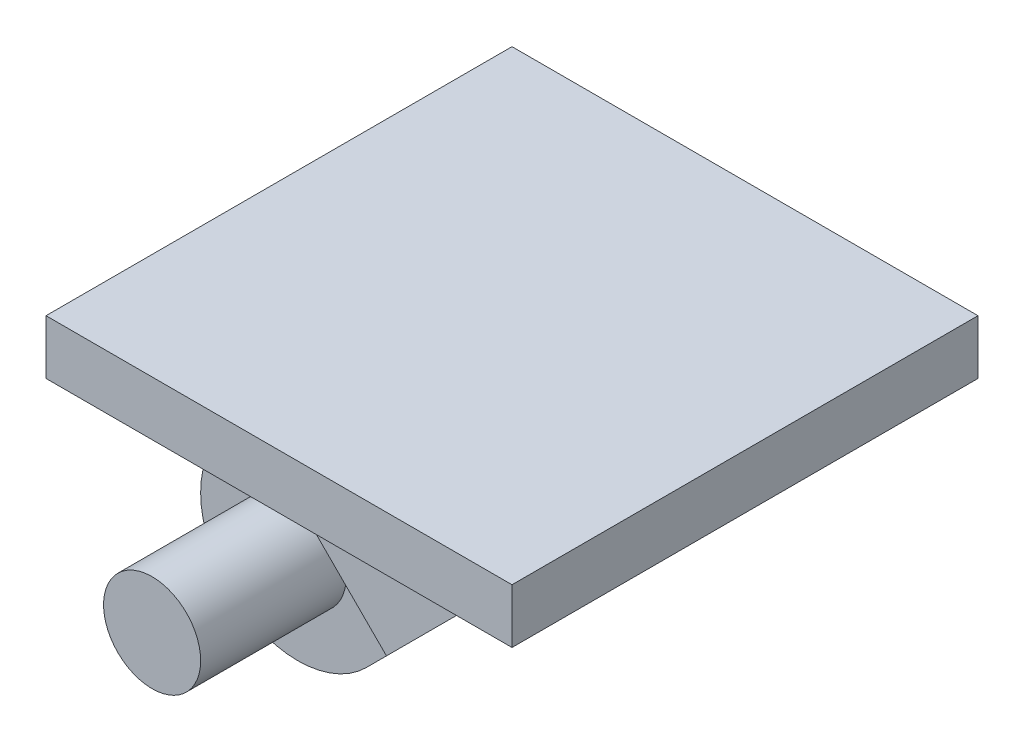
ISO-10303-21;
HEADER;
FILE_DESCRIPTION(('STEP AP214'),'2;1');
FILE_NAME('part.step','',(''),(''),'','','');
FILE_SCHEMA(('AUTOMOTIVE_DESIGN { 1 0 10303 214 1 1 1 1 }'));
ENDSEC;
DATA;
#1=APPLICATION_CONTEXT('core data for automotive mechanical design processes');
#2=APPLICATION_PROTOCOL_DEFINITION('international standard','automotive_design',2000,#1);
#3=PRODUCT_CONTEXT('',#1,'mechanical');
#4=PRODUCT('Part','Part','',(#3));
#5=PRODUCT_RELATED_PRODUCT_CATEGORY('part','',(#4));
#6=PRODUCT_DEFINITION_FORMATION('','',#4);
#7=PRODUCT_DEFINITION_CONTEXT('part definition',#1,'design');
#8=PRODUCT_DEFINITION('design','',#6,#7);
#9=PRODUCT_DEFINITION_SHAPE('','',#8);
#10=(LENGTH_UNIT() NAMED_UNIT(*) SI_UNIT(.MILLI.,.METRE.));
#11=(NAMED_UNIT(*) PLANE_ANGLE_UNIT() SI_UNIT($,.RADIAN.));
#12=(NAMED_UNIT(*) SI_UNIT($,.STERADIAN.) SOLID_ANGLE_UNIT());
#13=UNCERTAINTY_MEASURE_WITH_UNIT(LENGTH_MEASURE(1.E-05),#10,'distance_accuracy_value','');
#14=(GEOMETRIC_REPRESENTATION_CONTEXT(3) GLOBAL_UNCERTAINTY_ASSIGNED_CONTEXT((#13)) GLOBAL_UNIT_ASSIGNED_CONTEXT((#10,
#11,#12)) REPRESENTATION_CONTEXT('',''));
#15=CARTESIAN_POINT('',(0.,0.,0.));
#16=DIRECTION('',(0.,0.,1.));
#17=DIRECTION('',(1.,0.,0.));
#18=AXIS2_PLACEMENT_3D('',#15,#16,#17);
#19=CARTESIAN_POINT('',(-12.5,0.,-12.5));
#20=DIRECTION('',(-0.707106781186546,0.707106781186549,0.));
#21=DIRECTION('',(-0.707106781186549,-0.707106781186546,0.));
#22=AXIS2_PLACEMENT_3D('',#19,#20,#21);
#23=PLANE('',#22);
#24=DIRECTION('',(0.70710678118655,0.707106781186545,0.));
#25=VECTOR('',#24,1.);
#26=CARTESIAN_POINT('',(-30.1776695296637,-17.6776695296636,6.25));
#27=LINE('',#26,#25);
#28=CARTESIAN_POINT('',(-30.1776695296637,-17.6776695296637,6.25));
#29=VERTEX_POINT('',#28);
#30=CARTESIAN_POINT('',(-21.3388347648319,-8.8388347648319,6.25));
#31=VERTEX_POINT('',#30);
#32=EDGE_CURVE('E143',#29,#31,#27,.T.);
#33=ORIENTED_EDGE('',*,*,#32,.T.);
#34=DIRECTION('',(0.,0.,1.));
#35=VECTOR('',#34,1.);
#36=CARTESIAN_POINT('',(-21.3388347648319,-8.8388347648319,6.25));
#37=LINE('',#36,#35);
#38=CARTESIAN_POINT('',(-21.3388347648319,-8.8388347648319,12.5));
#39=VERTEX_POINT('',#38);
#40=EDGE_CURVE('E299',#31,#39,#37,.T.);
#41=ORIENTED_EDGE('',*,*,#40,.T.);
#42=DIRECTION('',(-0.707106781186549,-0.707106781186546,0.));
#43=VECTOR('',#42,1.);
#44=CARTESIAN_POINT('',(-12.5,0.,12.5));
#45=LINE('',#44,#43);
#46=CARTESIAN_POINT('',(-12.5,0.,12.5));
#47=VERTEX_POINT('',#46);
#48=EDGE_CURVE('E323',#47,#39,#45,.T.);
#49=ORIENTED_EDGE('',*,*,#48,.F.);
#50=DIRECTION('',(0.,0.,1.));
#51=VECTOR('',#50,1.);
#52=CARTESIAN_POINT('',(-12.5,0.,-12.5));
#53=LINE('',#52,#51);
#54=CARTESIAN_POINT('',(-12.5,0.,-12.5));
#55=VERTEX_POINT('',#54);
#56=EDGE_CURVE('E333',#55,#47,#53,.T.);
#57=ORIENTED_EDGE('',*,*,#56,.F.);
#58=DIRECTION('',(-0.707106781186549,-0.707106781186546,0.));
#59=VECTOR('',#58,1.);
#60=CARTESIAN_POINT('',(-12.5,0.,-12.5));
#61=LINE('',#60,#59);
#62=CARTESIAN_POINT('',(-21.3388347648319,-8.83883476483189,-12.5));
#63=VERTEX_POINT('',#62);
#64=EDGE_CURVE('E161',#55,#63,#61,.T.);
#65=ORIENTED_EDGE('',*,*,#64,.T.);
#66=DIRECTION('',(0.,0.,-1.));
#67=VECTOR('',#66,1.);
#68=CARTESIAN_POINT('',(-21.3388347648319,-8.8388347648319,-6.25));
#69=LINE('',#68,#67);
#70=CARTESIAN_POINT('',(-21.3388347648319,-8.8388347648319,-6.25));
#71=VERTEX_POINT('',#70);
#72=EDGE_CURVE('E64',#71,#63,#69,.T.);
#73=ORIENTED_EDGE('',*,*,#72,.F.);
#74=DIRECTION('',(-0.70710678118655,-0.707106781186545,0.));
#75=VECTOR('',#74,1.);
#76=CARTESIAN_POINT('',(-30.1776695296637,-17.6776695296636,-6.25));
#77=LINE('',#76,#75);
#78=CARTESIAN_POINT('',(-30.1776695296637,-17.6776695296637,-6.25));
#79=VERTEX_POINT('',#78);
#80=EDGE_CURVE('E305',#71,#79,#77,.T.);
#81=ORIENTED_EDGE('',*,*,#80,.T.);
#82=DIRECTION('',(0.,0.,1.));
#83=VECTOR('',#82,1.);
#84=CARTESIAN_POINT('',(-30.1776695296637,-17.6776695296637,-12.5));
#85=LINE('',#84,#83);
#86=EDGE_CURVE('E186',#79,#29,#85,.T.);
#87=ORIENTED_EDGE('',*,*,#86,.T.);
#88=EDGE_LOOP('',(#33,#41,#49,#57,#65,#73,#81,#87));
#89=FACE_BOUND('',#88,.T.);
#90=ADVANCED_FACE('F41',(#89),#23,.T.);
#91=CARTESIAN_POINT('',(-12.5000000000001,-35.3553390593274,-12.5));
#92=DIRECTION('',(0.707106781186547,-0.707106781186548,0.));
#93=DIRECTION('',(0.707106781186548,0.707106781186547,0.));
#94=AXIS2_PLACEMENT_3D('',#91,#92,#93);
#95=PLANE('',#94);
#96=DIRECTION('',(0.707106781186548,0.707106781186547,0.));
#97=VECTOR('',#96,1.);
#98=CARTESIAN_POINT('',(-12.5000000000001,-35.3553390593274,12.5));
#99=LINE('',#98,#97);
#100=CARTESIAN_POINT('',(-3.66116523516812,-26.5165042944955,12.5));
#101=VERTEX_POINT('',#100);
#102=CARTESIAN_POINT('',(5.17766952966365,-17.6776695296637,12.5));
#103=VERTEX_POINT('',#102);
#104=EDGE_CURVE('E316',#101,#103,#99,.T.);
#105=ORIENTED_EDGE('',*,*,#104,.F.);
#106=DIRECTION('',(0.,0.,1.));
#107=VECTOR('',#106,1.);
#108=CARTESIAN_POINT('',(-3.66116523516814,-26.5165042944955,6.25));
#109=LINE('',#108,#107);
#110=CARTESIAN_POINT('',(-3.66116523516814,-26.5165042944955,6.25));
#111=VERTEX_POINT('',#110);
#112=EDGE_CURVE('E56',#111,#101,#109,.T.);
#113=ORIENTED_EDGE('',*,*,#112,.F.);
#114=DIRECTION('',(-0.707106781186548,-0.707106781186548,0.));
#115=VECTOR('',#114,1.);
#116=CARTESIAN_POINT('',(-12.5,-35.3553390593274,6.25));
#117=LINE('',#116,#115);
#118=CARTESIAN_POINT('',(-12.5000000000001,-35.3553390593274,6.25));
#119=VERTEX_POINT('',#118);
#120=EDGE_CURVE('E141',#111,#119,#117,.T.);
#121=ORIENTED_EDGE('',*,*,#120,.T.);
#122=DIRECTION('',(0.,0.,1.));
#123=VECTOR('',#122,1.);
#124=CARTESIAN_POINT('',(-12.5000000000001,-35.3553390593274,-12.5));
#125=LINE('',#124,#123);
#126=CARTESIAN_POINT('',(-12.5000000000001,-35.3553390593274,-6.25));
#127=VERTEX_POINT('',#126);
#128=EDGE_CURVE('E154',#127,#119,#125,.T.);
#129=ORIENTED_EDGE('',*,*,#128,.F.);
#130=DIRECTION('',(0.707106781186548,0.707106781186548,0.));
#131=VECTOR('',#130,1.);
#132=CARTESIAN_POINT('',(-12.5,-35.3553390593274,-6.25));
#133=LINE('',#132,#131);
#134=CARTESIAN_POINT('',(-3.66116523516814,-26.5165042944955,-6.25));
#135=VERTEX_POINT('',#134);
#136=EDGE_CURVE('E309',#127,#135,#133,.T.);
#137=ORIENTED_EDGE('',*,*,#136,.T.);
#138=DIRECTION('',(0.,0.,-1.));
#139=VECTOR('',#138,1.);
#140=CARTESIAN_POINT('',(-3.66116523516814,-26.5165042944955,-6.25));
#141=LINE('',#140,#139);
#142=CARTESIAN_POINT('',(-3.66116523516814,-26.5165042944955,-12.5));
#143=VERTEX_POINT('',#142);
#144=EDGE_CURVE('E311',#135,#143,#141,.T.);
#145=ORIENTED_EDGE('',*,*,#144,.T.);
#146=DIRECTION('',(0.707106781186548,0.707106781186547,0.));
#147=VECTOR('',#146,1.);
#148=CARTESIAN_POINT('',(-12.5000000000001,-35.3553390593274,-12.5));
#149=LINE('',#148,#147);
#150=CARTESIAN_POINT('',(5.17766952966365,-17.6776695296637,-12.5));
#151=VERTEX_POINT('',#150);
#152=EDGE_CURVE('E325',#143,#151,#149,.T.);
#153=ORIENTED_EDGE('',*,*,#152,.T.);
#154=DIRECTION('',(0.,0.,1.));
#155=VECTOR('',#154,1.);
#156=CARTESIAN_POINT('',(5.17766952966365,-17.6776695296637,-12.5));
#157=LINE('',#156,#155);
#158=EDGE_CURVE('E160',#151,#103,#157,.T.);
#159=ORIENTED_EDGE('',*,*,#158,.T.);
#160=EDGE_LOOP('',(#105,#113,#121,#129,#137,#145,#153,#159));
#161=FACE_BOUND('',#160,.T.);
#162=ADVANCED_FACE('F152',(#161),#95,.T.);
#163=CARTESIAN_POINT('',(-21.3388347648319,-26.5165042944955,-12.5));
#164=DIRECTION('',(0.,0.,1.));
#165=DIRECTION('',(1.,0.,0.));
#166=AXIS2_PLACEMENT_3D('',#163,#164,#165);
#167=CYLINDRICAL_SURFACE('',#166,12.5);
#168=ORIENTED_EDGE('',*,*,#128,.T.);
#169=CARTESIAN_POINT('',(-21.3388347648319,-26.5165042944955,6.25));
#170=DIRECTION('',(0.,0.,1.));
#171=DIRECTION('',(1.,0.,0.));
#172=AXIS2_PLACEMENT_3D('',#169,#170,#171);
#173=CIRCLE('',#172,12.5);
#174=EDGE_CURVE('E137',#29,#119,#173,.T.);
#175=ORIENTED_EDGE('',*,*,#174,.F.);
#176=ORIENTED_EDGE('',*,*,#86,.F.);
#177=CARTESIAN_POINT('',(-21.3388347648319,-26.5165042944955,-6.25));
#178=DIRECTION('',(0.,0.,1.));
#179=DIRECTION('',(1.,0.,0.));
#180=AXIS2_PLACEMENT_3D('',#177,#178,#179);
#181=CIRCLE('',#180,12.5);
#182=EDGE_CURVE('E159',#79,#127,#181,.T.);
#183=ORIENTED_EDGE('',*,*,#182,.T.);
#184=EDGE_LOOP('',(#168,#175,#176,#183));
#185=FACE_BOUND('',#184,.T.);
#186=ADVANCED_FACE('F158',(#185),#167,.T.);
#187=CARTESIAN_POINT('',(-21.3388347648319,-26.5165042944955,12.5));
#188=DIRECTION('',(0.,0.,1.));
#189=DIRECTION('',(1.,0.,0.));
#190=AXIS2_PLACEMENT_3D('',#187,#188,#189);
#191=PLANE('',#190);
#192=ORIENTED_EDGE('',*,*,#48,.T.);
#193=DIRECTION('',(0.707106781186551,-0.707106781186544,0.));
#194=VECTOR('',#193,1.);
#195=CARTESIAN_POINT('',(-12.5000000000001,-17.6776695296636,12.5));
#196=LINE('',#195,#194);
#197=EDGE_CURVE('E155',#39,#101,#196,.T.);
#198=ORIENTED_EDGE('',*,*,#197,.T.);
#199=ORIENTED_EDGE('',*,*,#104,.T.);
#200=CARTESIAN_POINT('',(-12.5,0.,12.5));
#201=DIRECTION('',(0.,0.,1.));
#202=DIRECTION('',(1.,0.,0.));
#203=AXIS2_PLACEMENT_3D('',#200,#201,#202);
#204=CIRCLE('',#203,25.);
#205=CARTESIAN_POINT('',(12.5,0.,12.5));
#206=VERTEX_POINT('',#205);
#207=EDGE_CURVE('E318',#103,#206,#204,.T.);
#208=ORIENTED_EDGE('',*,*,#207,.T.);
#209=DIRECTION('',(-1.,0.,0.));
#210=VECTOR('',#209,1.);
#211=CARTESIAN_POINT('',(-12.5,0.,12.5));
#212=LINE('',#211,#210);
#213=EDGE_CURVE('E321',#206,#47,#212,.T.);
#214=ORIENTED_EDGE('',*,*,#213,.T.);
#215=EDGE_LOOP('',(#192,#198,#199,#208,#214));
#216=FACE_BOUND('',#215,.T.);
#217=ADVANCED_FACE('F245',(#216),#191,.T.);
#218=CARTESIAN_POINT('',(-21.3388347648319,-26.5165042944955,-12.5));
#219=DIRECTION('',(0.,0.,1.));
#220=DIRECTION('',(1.,0.,0.));
#221=AXIS2_PLACEMENT_3D('',#218,#219,#220);
#222=PLANE('',#221);
#223=DIRECTION('',(-0.707106781186551,0.707106781186544,0.));
#224=VECTOR('',#223,1.);
#225=CARTESIAN_POINT('',(-12.5000000000001,-17.6776695296636,-12.5));
#226=LINE('',#225,#224);
#227=EDGE_CURVE('E302',#143,#63,#226,.T.);
#228=ORIENTED_EDGE('',*,*,#227,.T.);
#229=ORIENTED_EDGE('',*,*,#64,.F.);
#230=DIRECTION('',(-1.,0.,0.));
#231=VECTOR('',#230,1.);
#232=CARTESIAN_POINT('',(-12.5,0.,-12.5));
#233=LINE('',#232,#231);
#234=CARTESIAN_POINT('',(12.5,0.,-12.5));
#235=VERTEX_POINT('',#234);
#236=EDGE_CURVE('E167',#235,#55,#233,.T.);
#237=ORIENTED_EDGE('',*,*,#236,.F.);
#238=CARTESIAN_POINT('',(-12.5,0.,-12.5));
#239=DIRECTION('',(0.,0.,1.));
#240=DIRECTION('',(1.,0.,0.));
#241=AXIS2_PLACEMENT_3D('',#238,#239,#240);
#242=CIRCLE('',#241,25.);
#243=EDGE_CURVE('E327',#151,#235,#242,.T.);
#244=ORIENTED_EDGE('',*,*,#243,.F.);
#245=ORIENTED_EDGE('',*,*,#152,.F.);
#246=EDGE_LOOP('',(#228,#229,#237,#244,#245));
#247=FACE_BOUND('',#246,.T.);
#248=ADVANCED_FACE('F242',(#247),#222,.F.);
#249=CARTESIAN_POINT('',(0.,0.,0.));
#250=DIRECTION('',(0.,-1.,0.));
#251=DIRECTION('',(0.,0.,-1.));
#252=AXIS2_PLACEMENT_3D('',#249,#250,#251);
#253=PLANE('',#252);
#254=DIRECTION('',(0.,0.,-1.));
#255=VECTOR('',#254,1.);
#256=CARTESIAN_POINT('',(30.,0.,30.));
#257=LINE('',#256,#255);
#258=CARTESIAN_POINT('',(30.,0.,30.));
#259=VERTEX_POINT('',#258);
#260=CARTESIAN_POINT('',(30.,0.,-30.));
#261=VERTEX_POINT('',#260);
#262=EDGE_CURVE('E182',#259,#261,#257,.T.);
#263=ORIENTED_EDGE('',*,*,#262,.F.);
#264=DIRECTION('',(1.,0.,0.));
#265=VECTOR('',#264,1.);
#266=CARTESIAN_POINT('',(-30.,0.,30.));
#267=LINE('',#266,#265);
#268=CARTESIAN_POINT('',(-30.,0.,30.));
#269=VERTEX_POINT('',#268);
#270=EDGE_CURVE('E175',#269,#259,#267,.T.);
#271=ORIENTED_EDGE('',*,*,#270,.F.);
#272=DIRECTION('',(0.,0.,1.));
#273=VECTOR('',#272,1.);
#274=CARTESIAN_POINT('',(-30.,0.,30.));
#275=LINE('',#274,#273);
#276=CARTESIAN_POINT('',(-30.,0.,-30.));
#277=VERTEX_POINT('',#276);
#278=EDGE_CURVE('E188',#277,#269,#275,.T.);
#279=ORIENTED_EDGE('',*,*,#278,.F.);
#280=DIRECTION('',(-1.,0.,0.));
#281=VECTOR('',#280,1.);
#282=CARTESIAN_POINT('',(-30.,0.,-30.));
#283=LINE('',#282,#281);
#284=EDGE_CURVE('E185',#261,#277,#283,.T.);
#285=ORIENTED_EDGE('',*,*,#284,.F.);
#286=EDGE_LOOP('',(#263,#271,#279,#285));
#287=FACE_BOUND('',#286,.T.);
#288=ORIENTED_EDGE('',*,*,#236,.T.);
#289=ORIENTED_EDGE('',*,*,#56,.T.);
#290=ORIENTED_EDGE('',*,*,#213,.F.);
#291=DIRECTION('',(0.,0.,1.));
#292=VECTOR('',#291,1.);
#293=CARTESIAN_POINT('',(12.5,0.,-12.5));
#294=LINE('',#293,#292);
#295=EDGE_CURVE('E164',#235,#206,#294,.T.);
#296=ORIENTED_EDGE('',*,*,#295,.F.);
#297=EDGE_LOOP('',(#288,#289,#290,#296));
#298=FACE_BOUND('',#297,.T.);
#299=ADVANCED_FACE('F209',(#287,#298),#253,.T.);
#300=CARTESIAN_POINT('',(30.,7.,30.));
#301=DIRECTION('',(-1.,0.,0.));
#302=DIRECTION('',(0.,0.,1.));
#303=AXIS2_PLACEMENT_3D('',#300,#301,#302);
#304=PLANE('',#303);
#305=ORIENTED_EDGE('',*,*,#262,.T.);
#306=DIRECTION('',(0.,-1.,0.));
#307=VECTOR('',#306,1.);
#308=CARTESIAN_POINT('',(30.,7.,-30.));
#309=LINE('',#308,#307);
#310=CARTESIAN_POINT('',(30.,7.,-30.));
#311=VERTEX_POINT('',#310);
#312=EDGE_CURVE('E49',#311,#261,#309,.T.);
#313=ORIENTED_EDGE('',*,*,#312,.F.);
#314=DIRECTION('',(0.,0.,-1.));
#315=VECTOR('',#314,1.);
#316=CARTESIAN_POINT('',(30.,7.,30.));
#317=LINE('',#316,#315);
#318=CARTESIAN_POINT('',(30.,7.,30.));
#319=VERTEX_POINT('',#318);
#320=EDGE_CURVE('E171',#319,#311,#317,.T.);
#321=ORIENTED_EDGE('',*,*,#320,.F.);
#322=DIRECTION('',(0.,-1.,0.));
#323=VECTOR('',#322,1.);
#324=CARTESIAN_POINT('',(30.,7.,30.));
#325=LINE('',#324,#323);
#326=EDGE_CURVE('E181',#319,#259,#325,.T.);
#327=ORIENTED_EDGE('',*,*,#326,.T.);
#328=EDGE_LOOP('',(#305,#313,#321,#327));
#329=FACE_BOUND('',#328,.T.);
#330=ADVANCED_FACE('F43',(#329),#304,.F.);
#331=CARTESIAN_POINT('',(-30.,7.,-30.));
#332=DIRECTION('',(0.,0.,1.));
#333=DIRECTION('',(1.,0.,0.));
#334=AXIS2_PLACEMENT_3D('',#331,#332,#333);
#335=PLANE('',#334);
#336=ORIENTED_EDGE('',*,*,#284,.T.);
#337=DIRECTION('',(0.,-1.,0.));
#338=VECTOR('',#337,1.);
#339=CARTESIAN_POINT('',(-30.,7.,-30.));
#340=LINE('',#339,#338);
#341=CARTESIAN_POINT('',(-30.,7.,-30.));
#342=VERTEX_POINT('',#341);
#343=EDGE_CURVE('E196',#342,#277,#340,.T.);
#344=ORIENTED_EDGE('',*,*,#343,.F.);
#345=DIRECTION('',(-1.,0.,0.));
#346=VECTOR('',#345,1.);
#347=CARTESIAN_POINT('',(-30.,7.,-30.));
#348=LINE('',#347,#346);
#349=EDGE_CURVE('E174',#311,#342,#348,.T.);
#350=ORIENTED_EDGE('',*,*,#349,.F.);
#351=ORIENTED_EDGE('',*,*,#312,.T.);
#352=EDGE_LOOP('',(#336,#344,#350,#351));
#353=FACE_BOUND('',#352,.T.);
#354=ADVANCED_FACE('F201',(#353),#335,.F.);
#355=CARTESIAN_POINT('',(-30.,7.,30.));
#356=DIRECTION('',(1.,0.,0.));
#357=DIRECTION('',(0.,0.,-1.));
#358=AXIS2_PLACEMENT_3D('',#355,#356,#357);
#359=PLANE('',#358);
#360=ORIENTED_EDGE('',*,*,#278,.T.);
#361=DIRECTION('',(0.,-1.,0.));
#362=VECTOR('',#361,1.);
#363=CARTESIAN_POINT('',(-30.,7.,30.));
#364=LINE('',#363,#362);
#365=CARTESIAN_POINT('',(-30.,7.,30.));
#366=VERTEX_POINT('',#365);
#367=EDGE_CURVE('E193',#366,#269,#364,.T.);
#368=ORIENTED_EDGE('',*,*,#367,.F.);
#369=DIRECTION('',(0.,0.,1.));
#370=VECTOR('',#369,1.);
#371=CARTESIAN_POINT('',(-30.,7.,30.));
#372=LINE('',#371,#370);
#373=EDGE_CURVE('E177',#342,#366,#372,.T.);
#374=ORIENTED_EDGE('',*,*,#373,.F.);
#375=ORIENTED_EDGE('',*,*,#343,.T.);
#376=EDGE_LOOP('',(#360,#368,#374,#375));
#377=FACE_BOUND('',#376,.T.);
#378=ADVANCED_FACE('F214',(#377),#359,.F.);
#379=CARTESIAN_POINT('',(-30.,7.,30.));
#380=DIRECTION('',(0.,0.,-1.));
#381=DIRECTION('',(-1.,0.,0.));
#382=AXIS2_PLACEMENT_3D('',#379,#380,#381);
#383=PLANE('',#382);
#384=ORIENTED_EDGE('',*,*,#270,.T.);
#385=ORIENTED_EDGE('',*,*,#326,.F.);
#386=DIRECTION('',(1.,0.,0.));
#387=VECTOR('',#386,1.);
#388=CARTESIAN_POINT('',(-30.,7.,30.));
#389=LINE('',#388,#387);
#390=EDGE_CURVE('E179',#366,#319,#389,.T.);
#391=ORIENTED_EDGE('',*,*,#390,.F.);
#392=ORIENTED_EDGE('',*,*,#367,.T.);
#393=EDGE_LOOP('',(#384,#385,#391,#392));
#394=FACE_BOUND('',#393,.T.);
#395=ADVANCED_FACE('F218',(#394),#383,.F.);
#396=CARTESIAN_POINT('',(0.,7.,0.));
#397=DIRECTION('',(0.,-1.,0.));
#398=DIRECTION('',(0.,0.,-1.));
#399=AXIS2_PLACEMENT_3D('',#396,#397,#398);
#400=PLANE('',#399);
#401=ORIENTED_EDGE('',*,*,#320,.T.);
#402=ORIENTED_EDGE('',*,*,#349,.T.);
#403=ORIENTED_EDGE('',*,*,#373,.T.);
#404=ORIENTED_EDGE('',*,*,#390,.T.);
#405=EDGE_LOOP('',(#401,#402,#403,#404));
#406=FACE_BOUND('',#405,.T.);
#407=ADVANCED_FACE('F220',(#406),#400,.F.);
#408=CARTESIAN_POINT('',(-12.5,0.,-12.5));
#409=DIRECTION('',(0.,0.,1.));
#410=DIRECTION('',(1.,0.,0.));
#411=AXIS2_PLACEMENT_3D('',#408,#409,#410);
#412=CYLINDRICAL_SURFACE('',#411,25.);
#413=ORIENTED_EDGE('',*,*,#295,.T.);
#414=ORIENTED_EDGE('',*,*,#207,.F.);
#415=ORIENTED_EDGE('',*,*,#158,.F.);
#416=ORIENTED_EDGE('',*,*,#243,.T.);
#417=EDGE_LOOP('',(#413,#414,#415,#416));
#418=FACE_BOUND('',#417,.T.);
#419=ADVANCED_FACE('F222',(#418),#412,.T.);
#420=CARTESIAN_POINT('',(-12.5000000000001,-17.6776695296636,-6.25));
#421=DIRECTION('',(-0.707106781186544,-0.707106781186551,0.));
#422=DIRECTION('',(0.707106781186551,-0.707106781186544,0.));
#423=AXIS2_PLACEMENT_3D('',#420,#421,#422);
#424=PLANE('',#423);
#425=ORIENTED_EDGE('',*,*,#227,.F.);
#426=ORIENTED_EDGE('',*,*,#144,.F.);
#427=DIRECTION('',(-0.707106781186551,0.707106781186544,0.));
#428=VECTOR('',#427,1.);
#429=CARTESIAN_POINT('',(-12.5000000000001,-17.6776695296636,-6.25));
#430=LINE('',#429,#428);
#431=EDGE_CURVE('E303',#135,#71,#430,.T.);
#432=ORIENTED_EDGE('',*,*,#431,.T.);
#433=ORIENTED_EDGE('',*,*,#72,.T.);
#434=EDGE_LOOP('',(#425,#426,#432,#433));
#435=FACE_BOUND('',#434,.T.);
#436=ADVANCED_FACE('F228',(#435),#424,.T.);
#437=CARTESIAN_POINT('',(-21.3388347648319,-26.5165042944955,-6.25));
#438=DIRECTION('',(0.,0.,1.));
#439=DIRECTION('',(1.,0.,0.));
#440=AXIS2_PLACEMENT_3D('',#437,#438,#439);
#441=PLANE('',#440);
#442=CARTESIAN_POINT('',(-21.3388347648319,-26.5165042944955,-6.25));
#443=DIRECTION('',(0.,0.,1.));
#444=DIRECTION('',(1.,0.,0.));
#445=AXIS2_PLACEMENT_3D('',#442,#443,#444);
#446=CIRCLE('',#445,6.25);
#447=CARTESIAN_POINT('',(-15.0888347648319,-26.5165042944955,-6.25));
#448=VERTEX_POINT('',#447);
#449=EDGE_CURVE('E289',#448,#448,#446,.T.);
#450=ORIENTED_EDGE('',*,*,#449,.T.);
#451=EDGE_LOOP('',(#450));
#452=FACE_BOUND('',#451,.T.);
#453=ORIENTED_EDGE('',*,*,#431,.F.);
#454=ORIENTED_EDGE('',*,*,#136,.F.);
#455=ORIENTED_EDGE('',*,*,#182,.F.);
#456=ORIENTED_EDGE('',*,*,#80,.F.);
#457=EDGE_LOOP('',(#453,#454,#455,#456));
#458=FACE_BOUND('',#457,.T.);
#459=ADVANCED_FACE('F258',(#452,#458),#441,.F.);
#460=CARTESIAN_POINT('',(-12.5000000000001,-17.6776695296636,6.25));
#461=DIRECTION('',(-0.707106781186544,-0.707106781186551,0.));
#462=DIRECTION('',(0.707106781186551,-0.707106781186544,0.));
#463=AXIS2_PLACEMENT_3D('',#460,#461,#462);
#464=PLANE('',#463);
#465=ORIENTED_EDGE('',*,*,#197,.F.);
#466=ORIENTED_EDGE('',*,*,#40,.F.);
#467=DIRECTION('',(0.707106781186551,-0.707106781186544,0.));
#468=VECTOR('',#467,1.);
#469=CARTESIAN_POINT('',(-12.5000000000001,-17.6776695296636,6.25));
#470=LINE('',#469,#468);
#471=EDGE_CURVE('E295',#31,#111,#470,.T.);
#472=ORIENTED_EDGE('',*,*,#471,.T.);
#473=ORIENTED_EDGE('',*,*,#112,.T.);
#474=EDGE_LOOP('',(#465,#466,#472,#473));
#475=FACE_BOUND('',#474,.T.);
#476=ADVANCED_FACE('F261',(#475),#464,.T.);
#477=CARTESIAN_POINT('',(-21.3388347648319,-26.5165042944955,6.25));
#478=DIRECTION('',(0.,0.,1.));
#479=DIRECTION('',(1.,0.,0.));
#480=AXIS2_PLACEMENT_3D('',#477,#478,#479);
#481=PLANE('',#480);
#482=CARTESIAN_POINT('',(-21.3388347648319,-26.5165042944955,6.25));
#483=DIRECTION('',(0.,0.,1.));
#484=DIRECTION('',(1.,0.,0.));
#485=AXIS2_PLACEMENT_3D('',#482,#483,#484);
#486=CIRCLE('',#485,6.25);
#487=CARTESIAN_POINT('',(-15.0888347648319,-26.5165042944955,6.25));
#488=VERTEX_POINT('',#487);
#489=EDGE_CURVE('E11',#488,#488,#486,.T.);
#490=ORIENTED_EDGE('',*,*,#489,.F.);
#491=EDGE_LOOP('',(#490));
#492=FACE_BOUND('',#491,.T.);
#493=ORIENTED_EDGE('',*,*,#120,.F.);
#494=ORIENTED_EDGE('',*,*,#471,.F.);
#495=ORIENTED_EDGE('',*,*,#32,.F.);
#496=ORIENTED_EDGE('',*,*,#174,.T.);
#497=EDGE_LOOP('',(#493,#494,#495,#496));
#498=FACE_BOUND('',#497,.T.);
#499=ADVANCED_FACE('F139',(#492,#498),#481,.T.);
#500=CARTESIAN_POINT('',(-21.3388347648319,-26.5165042944955,25.));
#501=DIRECTION('',(0.,0.,1.));
#502=DIRECTION('',(1.,0.,0.));
#503=AXIS2_PLACEMENT_3D('',#500,#501,#502);
#504=PLANE('',#503);
#505=CARTESIAN_POINT('',(-21.3388347648319,-26.5165042944955,25.));
#506=DIRECTION('',(0.,0.,1.));
#507=DIRECTION('',(1.,0.,0.));
#508=AXIS2_PLACEMENT_3D('',#505,#506,#507);
#509=CIRCLE('',#508,6.25);
#510=CARTESIAN_POINT('',(-15.0888347648319,-26.5165042944955,25.));
#511=VERTEX_POINT('',#510);
#512=EDGE_CURVE('E284',#511,#511,#509,.T.);
#513=ORIENTED_EDGE('',*,*,#512,.T.);
#514=EDGE_LOOP('',(#513));
#515=FACE_BOUND('',#514,.T.);
#516=ADVANCED_FACE('F267',(#515),#504,.T.);
#517=CARTESIAN_POINT('',(-21.3388347648319,-26.5165042944955,-25.));
#518=DIRECTION('',(0.,0.,1.));
#519=DIRECTION('',(1.,0.,0.));
#520=AXIS2_PLACEMENT_3D('',#517,#518,#519);
#521=CYLINDRICAL_SURFACE('',#520,6.25);
#522=ORIENTED_EDGE('',*,*,#489,.T.);
#523=EDGE_LOOP('',(#522));
#524=FACE_BOUND('',#523,.T.);
#525=ORIENTED_EDGE('',*,*,#512,.F.);
#526=EDGE_LOOP('',(#525));
#527=FACE_BOUND('',#526,.T.);
#528=ADVANCED_FACE('F269',(#524,#527),#521,.T.);
#529=CARTESIAN_POINT('',(-21.3388347648319,-26.5165042944955,-25.));
#530=DIRECTION('',(0.,0.,1.));
#531=DIRECTION('',(1.,0.,0.));
#532=AXIS2_PLACEMENT_3D('',#529,#530,#531);
#533=CIRCLE('',#532,6.25);
#534=CARTESIAN_POINT('',(-15.0888347648319,-26.5165042944955,-25.));
#535=VERTEX_POINT('',#534);
#536=EDGE_CURVE('E286',#535,#535,#533,.T.);
#537=ORIENTED_EDGE('',*,*,#536,.T.);
#538=EDGE_LOOP('',(#537));
#539=FACE_BOUND('',#538,.T.);
#540=ORIENTED_EDGE('',*,*,#449,.F.);
#541=EDGE_LOOP('',(#540));
#542=FACE_BOUND('',#541,.T.);
#543=ADVANCED_FACE('F272',(#539,#542),#521,.T.);
#544=CARTESIAN_POINT('',(-21.3388347648319,-26.5165042944955,-25.));
#545=DIRECTION('',(0.,0.,1.));
#546=DIRECTION('',(1.,0.,0.));
#547=AXIS2_PLACEMENT_3D('',#544,#545,#546);
#548=PLANE('',#547);
#549=ORIENTED_EDGE('',*,*,#536,.F.);
#550=EDGE_LOOP('',(#549));
#551=FACE_BOUND('',#550,.T.);
#552=ADVANCED_FACE('F274',(#551),#548,.F.);
#553=CLOSED_SHELL('',(#90,#162,#186,#217,#248,#299,#330,#354,#378,#395,#407,#419,#436,#459,#476,
#499,#516,#528,#543,#552));
#554=MANIFOLD_SOLID_BREP('B2',#553);
#555=ADVANCED_BREP_SHAPE_REPRESENTATION('',(#18,#554),#14);
#556=SHAPE_DEFINITION_REPRESENTATION(#9,#555);
ENDSEC;
END-ISO-10303-21;
